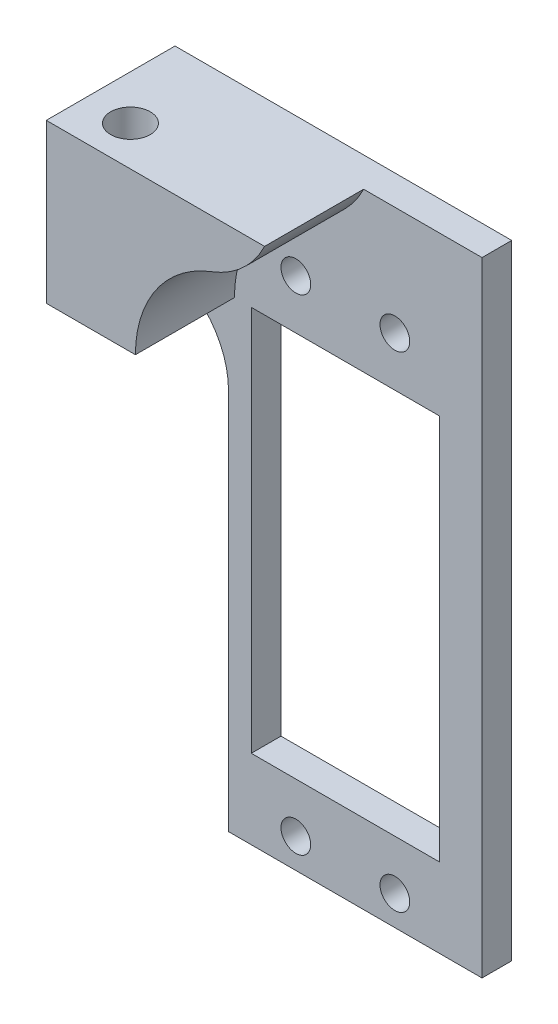
ISO-10303-21;
HEADER;
FILE_DESCRIPTION(('STEP AP214'),'2;1');
FILE_NAME('part.step','',(''),(''),'','','');
FILE_SCHEMA(('AUTOMOTIVE_DESIGN { 1 0 10303 214 1 1 1 1 }'));
ENDSEC;
DATA;
#1=APPLICATION_CONTEXT('core data for automotive mechanical design processes');
#2=APPLICATION_PROTOCOL_DEFINITION('international standard','automotive_design',2000,#1);
#3=PRODUCT_CONTEXT('',#1,'mechanical');
#4=PRODUCT('Part','Part','',(#3));
#5=PRODUCT_RELATED_PRODUCT_CATEGORY('part','',(#4));
#6=PRODUCT_DEFINITION_FORMATION('','',#4);
#7=PRODUCT_DEFINITION_CONTEXT('part definition',#1,'design');
#8=PRODUCT_DEFINITION('design','',#6,#7);
#9=PRODUCT_DEFINITION_SHAPE('','',#8);
#10=(LENGTH_UNIT() NAMED_UNIT(*) SI_UNIT(.MILLI.,.METRE.));
#11=(NAMED_UNIT(*) PLANE_ANGLE_UNIT() SI_UNIT($,.RADIAN.));
#12=(NAMED_UNIT(*) SI_UNIT($,.STERADIAN.) SOLID_ANGLE_UNIT());
#13=UNCERTAINTY_MEASURE_WITH_UNIT(LENGTH_MEASURE(1.E-05),#10,'distance_accuracy_value','');
#14=(GEOMETRIC_REPRESENTATION_CONTEXT(3) GLOBAL_UNCERTAINTY_ASSIGNED_CONTEXT((#13)) GLOBAL_UNIT_ASSIGNED_CONTEXT((#10,
#11,#12)) REPRESENTATION_CONTEXT('',''));
#15=CARTESIAN_POINT('',(0.,0.,0.));
#16=DIRECTION('',(0.,0.,1.));
#17=DIRECTION('',(1.,0.,0.));
#18=AXIS2_PLACEMENT_3D('',#15,#16,#17);
#19=CARTESIAN_POINT('',(-20.2,35.5,0.));
#20=DIRECTION('',(0.,1.,0.));
#21=DIRECTION('',(0.,0.,1.));
#22=AXIS2_PLACEMENT_3D('',#19,#20,#21);
#23=PLANE('',#22);
#24=DIRECTION('',(0.,0.,-1.));
#25=VECTOR('',#24,1.);
#26=CARTESIAN_POINT('',(13.8,35.5,3.));
#27=LINE('',#26,#25);
#28=CARTESIAN_POINT('',(13.8,35.5,3.));
#29=VERTEX_POINT('',#28);
#30=CARTESIAN_POINT('',(13.8,35.5,0.));
#31=VERTEX_POINT('',#30);
#32=EDGE_CURVE('E109',#29,#31,#27,.T.);
#33=ORIENTED_EDGE('',*,*,#32,.T.);
#34=DIRECTION('',(-1.,0.,0.));
#35=VECTOR('',#34,1.);
#36=CARTESIAN_POINT('',(-20.2,35.5,0.));
#37=LINE('',#36,#35);
#38=CARTESIAN_POINT('',(-20.2,35.5,0.));
#39=VERTEX_POINT('',#38);
#40=EDGE_CURVE('E102',#31,#39,#37,.T.);
#41=ORIENTED_EDGE('',*,*,#40,.T.);
#42=DIRECTION('',(0.,0.,-1.));
#43=VECTOR('',#42,1.);
#44=CARTESIAN_POINT('',(-20.2,35.5,3.));
#45=LINE('',#44,#43);
#46=CARTESIAN_POINT('',(-20.2,35.5,13.));
#47=VERTEX_POINT('',#46);
#48=EDGE_CURVE('E113',#47,#39,#45,.T.);
#49=ORIENTED_EDGE('',*,*,#48,.F.);
#50=DIRECTION('',(-1.,0.,0.));
#51=VECTOR('',#50,1.);
#52=CARTESIAN_POINT('',(-20.2,35.5,13.));
#53=LINE('',#52,#51);
#54=CARTESIAN_POINT('',(1.8435690653188,35.5,13.));
#55=VERTEX_POINT('',#54);
#56=EDGE_CURVE('E94',#55,#47,#53,.T.);
#57=ORIENTED_EDGE('',*,*,#56,.F.);
#58=DIRECTION('',(0.,0.,-1.));
#59=VECTOR('',#58,1.);
#60=CARTESIAN_POINT('',(1.8435690653188,35.5,3.));
#61=LINE('',#60,#59);
#62=CARTESIAN_POINT('',(1.8435690653188,35.5,3.));
#63=VERTEX_POINT('',#62);
#64=EDGE_CURVE('E93',#55,#63,#61,.T.);
#65=ORIENTED_EDGE('',*,*,#64,.T.);
#66=DIRECTION('',(-1.,0.,0.));
#67=VECTOR('',#66,1.);
#68=CARTESIAN_POINT('',(-20.2,35.5,3.));
#69=LINE('',#68,#67);
#70=EDGE_CURVE('E112',#29,#63,#69,.T.);
#71=ORIENTED_EDGE('',*,*,#70,.F.);
#72=EDGE_LOOP('',(#33,#41,#49,#57,#65,#71));
#73=FACE_BOUND('',#72,.T.);
#74=CARTESIAN_POINT('',(-15.7,35.5,9.));
#75=DIRECTION('',(0.,-1.,0.));
#76=DIRECTION('',(0.,0.,-1.));
#77=AXIS2_PLACEMENT_3D('',#74,#75,#76);
#78=CIRCLE('',#77,2.);
#79=CARTESIAN_POINT('',(-15.7,35.5,7.));
#80=VERTEX_POINT('',#79);
#81=EDGE_CURVE('E44',#80,#80,#78,.T.);
#82=ORIENTED_EDGE('',*,*,#81,.T.);
#83=EDGE_LOOP('',(#82));
#84=FACE_BOUND('',#83,.T.);
#85=ADVANCED_FACE('F34',(#73,#84),#23,.T.);
#86=CARTESIAN_POINT('',(-20.2,11.1,3.));
#87=DIRECTION('',(0.,0.,1.));
#88=DIRECTION('',(1.,0.,0.));
#89=AXIS2_PLACEMENT_3D('',#86,#87,#88);
#90=PLANE('',#89);
#91=CARTESIAN_POINT('',(5.,-24.5,3.));
#92=DIRECTION('',(0.,0.,1.));
#93=DIRECTION('',(1.,0.,0.));
#94=AXIS2_PLACEMENT_3D('',#91,#92,#93);
#95=CIRCLE('',#94,1.5);
#96=CARTESIAN_POINT('',(6.5,-24.5,3.));
#97=VERTEX_POINT('',#96);
#98=EDGE_CURVE('E127',#97,#97,#95,.T.);
#99=ORIENTED_EDGE('',*,*,#98,.F.);
#100=EDGE_LOOP('',(#99));
#101=FACE_BOUND('',#100,.T.);
#102=CARTESIAN_POINT('',(5.,24.5,3.));
#103=DIRECTION('',(0.,0.,1.));
#104=DIRECTION('',(1.,0.,0.));
#105=AXIS2_PLACEMENT_3D('',#102,#103,#104);
#106=CIRCLE('',#105,1.5);
#107=CARTESIAN_POINT('',(6.5,24.5,3.));
#108=VERTEX_POINT('',#107);
#109=EDGE_CURVE('E139',#108,#108,#106,.T.);
#110=ORIENTED_EDGE('',*,*,#109,.F.);
#111=EDGE_LOOP('',(#110));
#112=FACE_BOUND('',#111,.T.);
#113=DIRECTION('',(-1.,0.,0.));
#114=VECTOR('',#113,1.);
#115=CARTESIAN_POINT('',(-9.5,19.5,3.));
#116=LINE('',#115,#114);
#117=CARTESIAN_POINT('',(9.5,19.5,3.));
#118=VERTEX_POINT('',#117);
#119=CARTESIAN_POINT('',(-9.5,19.5,3.));
#120=VERTEX_POINT('',#119);
#121=EDGE_CURVE('E155',#118,#120,#116,.T.);
#122=ORIENTED_EDGE('',*,*,#121,.F.);
#123=DIRECTION('',(0.,1.,0.));
#124=VECTOR('',#123,1.);
#125=CARTESIAN_POINT('',(9.5,19.5,3.));
#126=LINE('',#125,#124);
#127=CARTESIAN_POINT('',(9.5,-19.5,3.));
#128=VERTEX_POINT('',#127);
#129=EDGE_CURVE('E151',#128,#118,#126,.T.);
#130=ORIENTED_EDGE('',*,*,#129,.F.);
#131=DIRECTION('',(1.,0.,0.));
#132=VECTOR('',#131,1.);
#133=CARTESIAN_POINT('',(-9.5,-19.5,3.));
#134=LINE('',#133,#132);
#135=CARTESIAN_POINT('',(-9.5,-19.5,3.));
#136=VERTEX_POINT('',#135);
#137=EDGE_CURVE('E161',#136,#128,#134,.T.);
#138=ORIENTED_EDGE('',*,*,#137,.F.);
#139=DIRECTION('',(0.,-1.,0.));
#140=VECTOR('',#139,1.);
#141=CARTESIAN_POINT('',(-9.5,19.5,3.));
#142=LINE('',#141,#140);
#143=EDGE_CURVE('E158',#120,#136,#142,.T.);
#144=ORIENTED_EDGE('',*,*,#143,.F.);
#145=EDGE_LOOP('',(#122,#130,#138,#144));
#146=FACE_BOUND('',#145,.T.);
#147=CARTESIAN_POINT('',(-5.,24.5,3.));
#148=DIRECTION('',(0.,0.,1.));
#149=DIRECTION('',(1.,0.,0.));
#150=AXIS2_PLACEMENT_3D('',#147,#148,#149);
#151=CIRCLE('',#150,1.5);
#152=CARTESIAN_POINT('',(-3.5,24.5,3.));
#153=VERTEX_POINT('',#152);
#154=EDGE_CURVE('E145',#153,#153,#151,.T.);
#155=ORIENTED_EDGE('',*,*,#154,.F.);
#156=EDGE_LOOP('',(#155));
#157=FACE_BOUND('',#156,.T.);
#158=CARTESIAN_POINT('',(-4.99999999999999,-24.5,3.));
#159=DIRECTION('',(0.,0.,1.));
#160=DIRECTION('',(1.,0.,0.));
#161=AXIS2_PLACEMENT_3D('',#158,#159,#160);
#162=CIRCLE('',#161,1.5);
#163=CARTESIAN_POINT('',(-3.49999999999999,-24.5,3.));
#164=VERTEX_POINT('',#163);
#165=EDGE_CURVE('E133',#164,#164,#162,.T.);
#166=ORIENTED_EDGE('',*,*,#165,.F.);
#167=EDGE_LOOP('',(#166));
#168=FACE_BOUND('',#167,.T.);
#169=DIRECTION('',(0.,1.,0.));
#170=VECTOR('',#169,1.);
#171=CARTESIAN_POINT('',(13.8,38.5,3.));
#172=LINE('',#171,#170);
#173=CARTESIAN_POINT('',(13.8,-27.5,3.));
#174=VERTEX_POINT('',#173);
#175=EDGE_CURVE('E103',#174,#29,#172,.T.);
#176=ORIENTED_EDGE('',*,*,#175,.T.);
#177=ORIENTED_EDGE('',*,*,#70,.T.);
#178=CARTESIAN_POINT('',(-6.90000000000001,39.7,3.));
#179=DIRECTION('',(0.,0.,1.));
#180=DIRECTION('',(1.,0.,0.));
#181=AXIS2_PLACEMENT_3D('',#178,#179,#180);
#182=CIRCLE('',#181,9.7);
#183=CARTESIAN_POINT('',(-3.49494735447985,30.6172902456791,3.));
#184=VERTEX_POINT('',#183);
#185=EDGE_CURVE('E38',#184,#63,#182,.T.);
#186=ORIENTED_EDGE('',*,*,#185,.F.);
#187=CARTESIAN_POINT('',(0.672857142857135,19.5,3.));
#188=DIRECTION('',(0.,0.,-1.));
#189=DIRECTION('',(1.,0.,0.));
#190=AXIS2_PLACEMENT_3D('',#187,#188,#189);
#191=CIRCLE('',#190,11.8728571428571);
#192=CARTESIAN_POINT('',(-11.2,19.5,3.));
#193=VERTEX_POINT('',#192);
#194=EDGE_CURVE('E85',#193,#184,#191,.T.);
#195=ORIENTED_EDGE('',*,*,#194,.F.);
#196=DIRECTION('',(1.,0.,0.));
#197=VECTOR('',#196,1.);
#198=CARTESIAN_POINT('',(-20.2,19.5,3.));
#199=LINE('',#198,#197);
#200=CARTESIAN_POINT('',(-20.2,19.5,3.));
#201=VERTEX_POINT('',#200);
#202=EDGE_CURVE('E117',#201,#193,#199,.T.);
#203=ORIENTED_EDGE('',*,*,#202,.F.);
#204=CARTESIAN_POINT('',(-20.2,11.1,3.));
#205=DIRECTION('',(0.,0.,-1.));
#206=DIRECTION('',(1.,0.,0.));
#207=AXIS2_PLACEMENT_3D('',#204,#205,#206);
#208=CIRCLE('',#207,8.4);
#209=CARTESIAN_POINT('',(-11.8,11.1,3.));
#210=VERTEX_POINT('',#209);
#211=EDGE_CURVE('E107',#201,#210,#208,.T.);
#212=ORIENTED_EDGE('',*,*,#211,.T.);
#213=DIRECTION('',(0.,-1.,0.));
#214=VECTOR('',#213,1.);
#215=CARTESIAN_POINT('',(-11.8,11.1,3.));
#216=LINE('',#215,#214);
#217=CARTESIAN_POINT('',(-11.8,-27.5,3.));
#218=VERTEX_POINT('',#217);
#219=EDGE_CURVE('E187',#210,#218,#216,.T.);
#220=ORIENTED_EDGE('',*,*,#219,.T.);
#221=DIRECTION('',(1.,0.,0.));
#222=VECTOR('',#221,1.);
#223=CARTESIAN_POINT('',(-11.8,-27.5,3.));
#224=LINE('',#223,#222);
#225=EDGE_CURVE('E190',#218,#174,#224,.T.);
#226=ORIENTED_EDGE('',*,*,#225,.T.);
#227=EDGE_LOOP('',(#176,#177,#186,#195,#203,#212,#220,#226));
#228=FACE_BOUND('',#227,.T.);
#229=ADVANCED_FACE('F256',(#101,#112,#146,#157,#168,#228),#90,.T.);
#230=CARTESIAN_POINT('',(-11.8,11.1,3.));
#231=DIRECTION('',(1.,0.,0.));
#232=DIRECTION('',(0.,1.,0.));
#233=AXIS2_PLACEMENT_3D('',#230,#231,#232);
#234=PLANE('',#233);
#235=DIRECTION('',(0.,-1.,0.));
#236=VECTOR('',#235,1.);
#237=CARTESIAN_POINT('',(-11.8,11.1,0.));
#238=LINE('',#237,#236);
#239=CARTESIAN_POINT('',(-11.8,11.1,0.));
#240=VERTEX_POINT('',#239);
#241=CARTESIAN_POINT('',(-11.8,-27.5,0.));
#242=VERTEX_POINT('',#241);
#243=EDGE_CURVE('E202',#240,#242,#238,.T.);
#244=ORIENTED_EDGE('',*,*,#243,.T.);
#245=DIRECTION('',(0.,0.,-1.));
#246=VECTOR('',#245,1.);
#247=CARTESIAN_POINT('',(-11.8,-27.5,3.));
#248=LINE('',#247,#246);
#249=EDGE_CURVE('E209',#218,#242,#248,.T.);
#250=ORIENTED_EDGE('',*,*,#249,.F.);
#251=ORIENTED_EDGE('',*,*,#219,.F.);
#252=DIRECTION('',(0.,0.,-1.));
#253=VECTOR('',#252,1.);
#254=CARTESIAN_POINT('',(-11.8,11.1,3.));
#255=LINE('',#254,#253);
#256=EDGE_CURVE('E212',#210,#240,#255,.T.);
#257=ORIENTED_EDGE('',*,*,#256,.T.);
#258=EDGE_LOOP('',(#244,#250,#251,#257));
#259=FACE_BOUND('',#258,.T.);
#260=ADVANCED_FACE('F250',(#259),#234,.F.);
#261=CARTESIAN_POINT('',(-11.8,-27.5,3.));
#262=DIRECTION('',(0.,1.,0.));
#263=DIRECTION('',(0.,0.,1.));
#264=AXIS2_PLACEMENT_3D('',#261,#262,#263);
#265=PLANE('',#264);
#266=DIRECTION('',(1.,0.,0.));
#267=VECTOR('',#266,1.);
#268=CARTESIAN_POINT('',(-11.8,-27.5,0.));
#269=LINE('',#268,#267);
#270=CARTESIAN_POINT('',(13.8,-27.5,0.));
#271=VERTEX_POINT('',#270);
#272=EDGE_CURVE('E106',#242,#271,#269,.T.);
#273=ORIENTED_EDGE('',*,*,#272,.T.);
#274=DIRECTION('',(0.,0.,-1.));
#275=VECTOR('',#274,1.);
#276=CARTESIAN_POINT('',(13.8,-27.5,3.));
#277=LINE('',#276,#275);
#278=EDGE_CURVE('E193',#174,#271,#277,.T.);
#279=ORIENTED_EDGE('',*,*,#278,.F.);
#280=ORIENTED_EDGE('',*,*,#225,.F.);
#281=ORIENTED_EDGE('',*,*,#249,.T.);
#282=EDGE_LOOP('',(#273,#279,#280,#281));
#283=FACE_BOUND('',#282,.T.);
#284=ADVANCED_FACE('F302',(#283),#265,.F.);
#285=CARTESIAN_POINT('',(13.8,38.5,3.));
#286=DIRECTION('',(-1.,0.,0.));
#287=DIRECTION('',(0.,-1.,0.));
#288=AXIS2_PLACEMENT_3D('',#285,#286,#287);
#289=PLANE('',#288);
#290=ORIENTED_EDGE('',*,*,#32,.F.);
#291=ORIENTED_EDGE('',*,*,#175,.F.);
#292=ORIENTED_EDGE('',*,*,#278,.T.);
#293=DIRECTION('',(0.,1.,0.));
#294=VECTOR('',#293,1.);
#295=CARTESIAN_POINT('',(13.8,38.5,0.));
#296=LINE('',#295,#294);
#297=EDGE_CURVE('E98',#271,#31,#296,.T.);
#298=ORIENTED_EDGE('',*,*,#297,.T.);
#299=EDGE_LOOP('',(#290,#291,#292,#298));
#300=FACE_BOUND('',#299,.T.);
#301=ADVANCED_FACE('F306',(#300),#289,.F.);
#302=CARTESIAN_POINT('',(-9.5,-19.5,3.));
#303=DIRECTION('',(0.,1.,0.));
#304=DIRECTION('',(0.,0.,1.));
#305=AXIS2_PLACEMENT_3D('',#302,#303,#304);
#306=PLANE('',#305);
#307=DIRECTION('',(1.,0.,0.));
#308=VECTOR('',#307,1.);
#309=CARTESIAN_POINT('',(-9.5,-19.5,0.));
#310=LINE('',#309,#308);
#311=CARTESIAN_POINT('',(-9.5,-19.5,0.));
#312=VERTEX_POINT('',#311);
#313=CARTESIAN_POINT('',(9.5,-19.5,0.));
#314=VERTEX_POINT('',#313);
#315=EDGE_CURVE('E154',#312,#314,#310,.T.);
#316=ORIENTED_EDGE('',*,*,#315,.F.);
#317=DIRECTION('',(0.,0.,-1.));
#318=VECTOR('',#317,1.);
#319=CARTESIAN_POINT('',(-9.5,-19.5,3.));
#320=LINE('',#319,#318);
#321=EDGE_CURVE('E177',#136,#312,#320,.T.);
#322=ORIENTED_EDGE('',*,*,#321,.F.);
#323=ORIENTED_EDGE('',*,*,#137,.T.);
#324=DIRECTION('',(0.,0.,-1.));
#325=VECTOR('',#324,1.);
#326=CARTESIAN_POINT('',(9.5,-19.5,3.));
#327=LINE('',#326,#325);
#328=EDGE_CURVE('E164',#128,#314,#327,.T.);
#329=ORIENTED_EDGE('',*,*,#328,.T.);
#330=EDGE_LOOP('',(#316,#322,#323,#329));
#331=FACE_BOUND('',#330,.T.);
#332=ADVANCED_FACE('F344',(#331),#306,.T.);
#333=CARTESIAN_POINT('',(-9.5,19.5,3.));
#334=DIRECTION('',(1.,0.,0.));
#335=DIRECTION('',(0.,1.,0.));
#336=AXIS2_PLACEMENT_3D('',#333,#334,#335);
#337=PLANE('',#336);
#338=DIRECTION('',(0.,-1.,0.));
#339=VECTOR('',#338,1.);
#340=CARTESIAN_POINT('',(-9.5,19.5,0.));
#341=LINE('',#340,#339);
#342=CARTESIAN_POINT('',(-9.5,19.5,0.));
#343=VERTEX_POINT('',#342);
#344=EDGE_CURVE('E170',#343,#312,#341,.T.);
#345=ORIENTED_EDGE('',*,*,#344,.F.);
#346=DIRECTION('',(0.,0.,-1.));
#347=VECTOR('',#346,1.);
#348=CARTESIAN_POINT('',(-9.5,19.5,3.));
#349=LINE('',#348,#347);
#350=EDGE_CURVE('E180',#120,#343,#349,.T.);
#351=ORIENTED_EDGE('',*,*,#350,.F.);
#352=ORIENTED_EDGE('',*,*,#143,.T.);
#353=ORIENTED_EDGE('',*,*,#321,.T.);
#354=EDGE_LOOP('',(#345,#351,#352,#353));
#355=FACE_BOUND('',#354,.T.);
#356=ADVANCED_FACE('F290',(#355),#337,.T.);
#357=CARTESIAN_POINT('',(-9.5,19.5,3.));
#358=DIRECTION('',(0.,-1.,0.));
#359=DIRECTION('',(0.,0.,-1.));
#360=AXIS2_PLACEMENT_3D('',#357,#358,#359);
#361=PLANE('',#360);
#362=DIRECTION('',(-1.,0.,0.));
#363=VECTOR('',#362,1.);
#364=CARTESIAN_POINT('',(-9.5,19.5,0.));
#365=LINE('',#364,#363);
#366=CARTESIAN_POINT('',(9.5,19.5,0.));
#367=VERTEX_POINT('',#366);
#368=EDGE_CURVE('E167',#367,#343,#365,.T.);
#369=ORIENTED_EDGE('',*,*,#368,.F.);
#370=DIRECTION('',(0.,0.,-1.));
#371=VECTOR('',#370,1.);
#372=CARTESIAN_POINT('',(9.5,19.5,3.));
#373=LINE('',#372,#371);
#374=EDGE_CURVE('E101',#118,#367,#373,.T.);
#375=ORIENTED_EDGE('',*,*,#374,.F.);
#376=ORIENTED_EDGE('',*,*,#121,.T.);
#377=ORIENTED_EDGE('',*,*,#350,.T.);
#378=EDGE_LOOP('',(#369,#375,#376,#377));
#379=FACE_BOUND('',#378,.T.);
#380=ADVANCED_FACE('F284',(#379),#361,.T.);
#381=CARTESIAN_POINT('',(9.5,19.5,3.));
#382=DIRECTION('',(-1.,0.,0.));
#383=DIRECTION('',(0.,-1.,0.));
#384=AXIS2_PLACEMENT_3D('',#381,#382,#383);
#385=PLANE('',#384);
#386=DIRECTION('',(0.,1.,0.));
#387=VECTOR('',#386,1.);
#388=CARTESIAN_POINT('',(9.5,19.5,0.));
#389=LINE('',#388,#387);
#390=EDGE_CURVE('E148',#314,#367,#389,.T.);
#391=ORIENTED_EDGE('',*,*,#390,.F.);
#392=ORIENTED_EDGE('',*,*,#328,.F.);
#393=ORIENTED_EDGE('',*,*,#129,.T.);
#394=ORIENTED_EDGE('',*,*,#374,.T.);
#395=EDGE_LOOP('',(#391,#392,#393,#394));
#396=FACE_BOUND('',#395,.T.);
#397=ADVANCED_FACE('F281',(#396),#385,.T.);
#398=CARTESIAN_POINT('',(-5.,24.5,3.));
#399=DIRECTION('',(0.,0.,-1.));
#400=DIRECTION('',(-1.,0.,0.));
#401=AXIS2_PLACEMENT_3D('',#398,#399,#400);
#402=CYLINDRICAL_SURFACE('',#401,1.5);
#403=ORIENTED_EDGE('',*,*,#154,.T.);
#404=EDGE_LOOP('',(#403));
#405=FACE_BOUND('',#404,.T.);
#406=CARTESIAN_POINT('',(-5.,24.5,0.));
#407=DIRECTION('',(0.,0.,1.));
#408=DIRECTION('',(1.,0.,0.));
#409=AXIS2_PLACEMENT_3D('',#406,#407,#408);
#410=CIRCLE('',#409,1.5);
#411=CARTESIAN_POINT('',(-3.5,24.5,0.));
#412=VERTEX_POINT('',#411);
#413=EDGE_CURVE('E142',#412,#412,#410,.T.);
#414=ORIENTED_EDGE('',*,*,#413,.F.);
#415=EDGE_LOOP('',(#414));
#416=FACE_BOUND('',#415,.T.);
#417=ADVANCED_FACE('F417',(#405,#416),#402,.F.);
#418=CARTESIAN_POINT('',(5.,24.5,3.));
#419=DIRECTION('',(0.,0.,-1.));
#420=DIRECTION('',(-1.,0.,0.));
#421=AXIS2_PLACEMENT_3D('',#418,#419,#420);
#422=CYLINDRICAL_SURFACE('',#421,1.5);
#423=ORIENTED_EDGE('',*,*,#109,.T.);
#424=EDGE_LOOP('',(#423));
#425=FACE_BOUND('',#424,.T.);
#426=CARTESIAN_POINT('',(5.,24.5,0.));
#427=DIRECTION('',(0.,0.,1.));
#428=DIRECTION('',(1.,0.,0.));
#429=AXIS2_PLACEMENT_3D('',#426,#427,#428);
#430=CIRCLE('',#429,1.5);
#431=CARTESIAN_POINT('',(6.5,24.5,0.));
#432=VERTEX_POINT('',#431);
#433=EDGE_CURVE('E136',#432,#432,#430,.T.);
#434=ORIENTED_EDGE('',*,*,#433,.F.);
#435=EDGE_LOOP('',(#434));
#436=FACE_BOUND('',#435,.T.);
#437=ADVANCED_FACE('F407',(#425,#436),#422,.F.);
#438=CARTESIAN_POINT('',(-4.99999999999999,-24.5,3.));
#439=DIRECTION('',(0.,0.,-1.));
#440=DIRECTION('',(-1.,0.,0.));
#441=AXIS2_PLACEMENT_3D('',#438,#439,#440);
#442=CYLINDRICAL_SURFACE('',#441,1.5);
#443=ORIENTED_EDGE('',*,*,#165,.T.);
#444=EDGE_LOOP('',(#443));
#445=FACE_BOUND('',#444,.T.);
#446=CARTESIAN_POINT('',(-4.99999999999999,-24.5,0.));
#447=DIRECTION('',(0.,0.,1.));
#448=DIRECTION('',(1.,0.,0.));
#449=AXIS2_PLACEMENT_3D('',#446,#447,#448);
#450=CIRCLE('',#449,1.5);
#451=CARTESIAN_POINT('',(-3.49999999999999,-24.5,0.));
#452=VERTEX_POINT('',#451);
#453=EDGE_CURVE('E130',#452,#452,#450,.T.);
#454=ORIENTED_EDGE('',*,*,#453,.F.);
#455=EDGE_LOOP('',(#454));
#456=FACE_BOUND('',#455,.T.);
#457=ADVANCED_FACE('F398',(#445,#456),#442,.F.);
#458=CARTESIAN_POINT('',(5.,-24.5,3.));
#459=DIRECTION('',(0.,0.,-1.));
#460=DIRECTION('',(-1.,0.,0.));
#461=AXIS2_PLACEMENT_3D('',#458,#459,#460);
#462=CYLINDRICAL_SURFACE('',#461,1.5);
#463=ORIENTED_EDGE('',*,*,#98,.T.);
#464=EDGE_LOOP('',(#463));
#465=FACE_BOUND('',#464,.T.);
#466=CARTESIAN_POINT('',(5.,-24.5,0.));
#467=DIRECTION('',(0.,0.,1.));
#468=DIRECTION('',(1.,0.,0.));
#469=AXIS2_PLACEMENT_3D('',#466,#467,#468);
#470=CIRCLE('',#469,1.5);
#471=CARTESIAN_POINT('',(6.5,-24.5,0.));
#472=VERTEX_POINT('',#471);
#473=EDGE_CURVE('E126',#472,#472,#470,.T.);
#474=ORIENTED_EDGE('',*,*,#473,.F.);
#475=EDGE_LOOP('',(#474));
#476=FACE_BOUND('',#475,.T.);
#477=ADVANCED_FACE('F389',(#465,#476),#462,.F.);
#478=CARTESIAN_POINT('',(-20.2,11.1,3.));
#479=DIRECTION('',(0.,0.,-1.));
#480=DIRECTION('',(-1.,0.,0.));
#481=AXIS2_PLACEMENT_3D('',#478,#479,#480);
#482=CYLINDRICAL_SURFACE('',#481,8.4);
#483=CARTESIAN_POINT('',(-20.2,11.1,0.));
#484=DIRECTION('',(0.,0.,-1.));
#485=DIRECTION('',(1.,0.,0.));
#486=AXIS2_PLACEMENT_3D('',#483,#484,#485);
#487=CIRCLE('',#486,8.4);
#488=CARTESIAN_POINT('',(-20.2,19.5,0.));
#489=VERTEX_POINT('',#488);
#490=EDGE_CURVE('E199',#489,#240,#487,.T.);
#491=ORIENTED_EDGE('',*,*,#490,.T.);
#492=ORIENTED_EDGE('',*,*,#256,.F.);
#493=ORIENTED_EDGE('',*,*,#211,.F.);
#494=DIRECTION('',(0.,0.,-1.));
#495=VECTOR('',#494,1.);
#496=CARTESIAN_POINT('',(-20.2,19.5,3.));
#497=LINE('',#496,#495);
#498=EDGE_CURVE('E215',#201,#489,#497,.T.);
#499=ORIENTED_EDGE('',*,*,#498,.T.);
#500=EDGE_LOOP('',(#491,#492,#493,#499));
#501=FACE_BOUND('',#500,.T.);
#502=ADVANCED_FACE('F243',(#501),#482,.F.);
#503=CARTESIAN_POINT('',(-20.2,11.1,0.));
#504=DIRECTION('',(0.,0.,1.));
#505=DIRECTION('',(1.,0.,0.));
#506=AXIS2_PLACEMENT_3D('',#503,#504,#505);
#507=PLANE('',#506);
#508=ORIENTED_EDGE('',*,*,#473,.T.);
#509=EDGE_LOOP('',(#508));
#510=FACE_BOUND('',#509,.T.);
#511=ORIENTED_EDGE('',*,*,#453,.T.);
#512=EDGE_LOOP('',(#511));
#513=FACE_BOUND('',#512,.T.);
#514=ORIENTED_EDGE('',*,*,#433,.T.);
#515=EDGE_LOOP('',(#514));
#516=FACE_BOUND('',#515,.T.);
#517=ORIENTED_EDGE('',*,*,#413,.T.);
#518=EDGE_LOOP('',(#517));
#519=FACE_BOUND('',#518,.T.);
#520=ORIENTED_EDGE('',*,*,#390,.T.);
#521=ORIENTED_EDGE('',*,*,#368,.T.);
#522=ORIENTED_EDGE('',*,*,#344,.T.);
#523=ORIENTED_EDGE('',*,*,#315,.T.);
#524=EDGE_LOOP('',(#520,#521,#522,#523));
#525=FACE_BOUND('',#524,.T.);
#526=ORIENTED_EDGE('',*,*,#40,.F.);
#527=ORIENTED_EDGE('',*,*,#297,.F.);
#528=ORIENTED_EDGE('',*,*,#272,.F.);
#529=ORIENTED_EDGE('',*,*,#243,.F.);
#530=ORIENTED_EDGE('',*,*,#490,.F.);
#531=DIRECTION('',(0.,-1.,0.));
#532=VECTOR('',#531,1.);
#533=CARTESIAN_POINT('',(-20.2,19.5,0.));
#534=LINE('',#533,#532);
#535=EDGE_CURVE('E196',#39,#489,#534,.T.);
#536=ORIENTED_EDGE('',*,*,#535,.F.);
#537=EDGE_LOOP('',(#526,#527,#528,#529,#530,#536));
#538=FACE_BOUND('',#537,.T.);
#539=ADVANCED_FACE('F234',(#510,#513,#516,#519,#525,#538),#507,.F.);
#540=CARTESIAN_POINT('',(0.672857142857135,19.5,13.));
#541=DIRECTION('',(0.,0.,-1.));
#542=DIRECTION('',(-1.,0.,0.));
#543=AXIS2_PLACEMENT_3D('',#540,#541,#542);
#544=CYLINDRICAL_SURFACE('',#543,11.8728571428571);
#545=ORIENTED_EDGE('',*,*,#194,.T.);
#546=DIRECTION('',(0.,0.,-1.));
#547=VECTOR('',#546,1.);
#548=CARTESIAN_POINT('',(-3.49494735447985,30.6172902456791,13.));
#549=LINE('',#548,#547);
#550=CARTESIAN_POINT('',(-3.49494735447985,30.6172902456791,13.));
#551=VERTEX_POINT('',#550);
#552=EDGE_CURVE('E83',#551,#184,#549,.T.);
#553=ORIENTED_EDGE('',*,*,#552,.F.);
#554=CARTESIAN_POINT('',(0.672857142857135,19.5,13.));
#555=DIRECTION('',(0.,0.,-1.));
#556=DIRECTION('',(1.,0.,0.));
#557=AXIS2_PLACEMENT_3D('',#554,#555,#556);
#558=CIRCLE('',#557,11.8728571428571);
#559=CARTESIAN_POINT('',(-11.2,19.5,13.));
#560=VERTEX_POINT('',#559);
#561=EDGE_CURVE('E69',#560,#551,#558,.T.);
#562=ORIENTED_EDGE('',*,*,#561,.F.);
#563=DIRECTION('',(0.,0.,-1.));
#564=VECTOR('',#563,1.);
#565=CARTESIAN_POINT('',(-11.2,19.5,13.));
#566=LINE('',#565,#564);
#567=EDGE_CURVE('E88',#560,#193,#566,.T.);
#568=ORIENTED_EDGE('',*,*,#567,.T.);
#569=EDGE_LOOP('',(#545,#553,#562,#568));
#570=FACE_BOUND('',#569,.T.);
#571=ADVANCED_FACE('F84',(#570),#544,.F.);
#572=CARTESIAN_POINT('',(-20.2,19.5,13.));
#573=DIRECTION('',(0.,1.,0.));
#574=DIRECTION('',(0.,0.,1.));
#575=AXIS2_PLACEMENT_3D('',#572,#573,#574);
#576=PLANE('',#575);
#577=CARTESIAN_POINT('',(-15.7,19.5,9.));
#578=DIRECTION('',(0.,-1.,0.));
#579=DIRECTION('',(0.,0.,-1.));
#580=AXIS2_PLACEMENT_3D('',#577,#578,#579);
#581=CIRCLE('',#580,2.);
#582=CARTESIAN_POINT('',(-15.7,19.5,7.));
#583=VERTEX_POINT('',#582);
#584=EDGE_CURVE('E11',#583,#583,#581,.T.);
#585=ORIENTED_EDGE('',*,*,#584,.F.);
#586=EDGE_LOOP('',(#585));
#587=FACE_BOUND('',#586,.T.);
#588=ORIENTED_EDGE('',*,*,#202,.T.);
#589=ORIENTED_EDGE('',*,*,#567,.F.);
#590=DIRECTION('',(1.,0.,0.));
#591=VECTOR('',#590,1.);
#592=CARTESIAN_POINT('',(-20.2,19.5,13.));
#593=LINE('',#592,#591);
#594=CARTESIAN_POINT('',(-20.2,19.5,13.));
#595=VERTEX_POINT('',#594);
#596=EDGE_CURVE('E77',#595,#560,#593,.T.);
#597=ORIENTED_EDGE('',*,*,#596,.F.);
#598=DIRECTION('',(0.,0.,-1.));
#599=VECTOR('',#598,1.);
#600=CARTESIAN_POINT('',(-20.2,19.5,13.));
#601=LINE('',#600,#599);
#602=EDGE_CURVE('E87',#595,#201,#601,.T.);
#603=ORIENTED_EDGE('',*,*,#602,.T.);
#604=EDGE_LOOP('',(#588,#589,#597,#603));
#605=FACE_BOUND('',#604,.T.);
#606=ADVANCED_FACE('F315',(#587,#605),#576,.F.);
#607=CARTESIAN_POINT('',(-15.7,55.0568542494924,9.));
#608=DIRECTION('',(0.,-1.,0.));
#609=DIRECTION('',(0.,0.,-1.));
#610=AXIS2_PLACEMENT_3D('',#607,#608,#609);
#611=CYLINDRICAL_SURFACE('',#610,2.);
#612=ORIENTED_EDGE('',*,*,#584,.T.);
#613=EDGE_LOOP('',(#612));
#614=FACE_BOUND('',#613,.T.);
#615=ORIENTED_EDGE('',*,*,#81,.F.);
#616=EDGE_LOOP('',(#615));
#617=FACE_BOUND('',#616,.T.);
#618=ADVANCED_FACE('F36',(#614,#617),#611,.F.);
#619=CARTESIAN_POINT('',(-20.2,19.5,3.));
#620=DIRECTION('',(1.,0.,0.));
#621=DIRECTION('',(0.,1.,0.));
#622=AXIS2_PLACEMENT_3D('',#619,#620,#621);
#623=PLANE('',#622);
#624=ORIENTED_EDGE('',*,*,#535,.T.);
#625=ORIENTED_EDGE('',*,*,#498,.F.);
#626=ORIENTED_EDGE('',*,*,#602,.F.);
#627=DIRECTION('',(0.,-1.,0.));
#628=VECTOR('',#627,1.);
#629=CARTESIAN_POINT('',(-20.2,19.5,13.));
#630=LINE('',#629,#628);
#631=EDGE_CURVE('E95',#47,#595,#630,.T.);
#632=ORIENTED_EDGE('',*,*,#631,.F.);
#633=ORIENTED_EDGE('',*,*,#48,.T.);
#634=EDGE_LOOP('',(#624,#625,#626,#632,#633));
#635=FACE_BOUND('',#634,.T.);
#636=ADVANCED_FACE('F223',(#635),#623,.F.);
#637=CARTESIAN_POINT('',(-6.9,39.7,3.));
#638=DIRECTION('',(0.,0.,-1.));
#639=DIRECTION('',(-1.,0.,0.));
#640=AXIS2_PLACEMENT_3D('',#637,#638,#639);
#641=CYLINDRICAL_SURFACE('',#640,9.7);
#642=ORIENTED_EDGE('',*,*,#64,.F.);
#643=CARTESIAN_POINT('',(-6.90000000000001,39.7,13.));
#644=DIRECTION('',(0.,0.,1.));
#645=DIRECTION('',(1.,0.,0.));
#646=AXIS2_PLACEMENT_3D('',#643,#644,#645);
#647=CIRCLE('',#646,9.7);
#648=EDGE_CURVE('E75',#551,#55,#647,.T.);
#649=ORIENTED_EDGE('',*,*,#648,.F.);
#650=ORIENTED_EDGE('',*,*,#552,.T.);
#651=ORIENTED_EDGE('',*,*,#185,.T.);
#652=EDGE_LOOP('',(#642,#649,#650,#651));
#653=FACE_BOUND('',#652,.T.);
#654=ADVANCED_FACE('F91',(#653),#641,.T.);
#655=CARTESIAN_POINT('',(0.672857142857135,19.5,13.));
#656=DIRECTION('',(0.,0.,1.));
#657=DIRECTION('',(1.,0.,0.));
#658=AXIS2_PLACEMENT_3D('',#655,#656,#657);
#659=PLANE('',#658);
#660=ORIENTED_EDGE('',*,*,#648,.T.);
#661=ORIENTED_EDGE('',*,*,#56,.T.);
#662=ORIENTED_EDGE('',*,*,#631,.T.);
#663=ORIENTED_EDGE('',*,*,#596,.T.);
#664=ORIENTED_EDGE('',*,*,#561,.T.);
#665=EDGE_LOOP('',(#660,#661,#662,#663,#664));
#666=FACE_BOUND('',#665,.T.);
#667=ADVANCED_FACE('F71',(#666),#659,.T.);
#668=CLOSED_SHELL('',(#85,#229,#260,#284,#301,#332,#356,#380,#397,#417,#437,#457,#477,#502,#539,
#571,#606,#618,#636,#654,#667));
#669=MANIFOLD_SOLID_BREP('B2',#668);
#670=ADVANCED_BREP_SHAPE_REPRESENTATION('',(#18,#669),#14);
#671=SHAPE_DEFINITION_REPRESENTATION(#9,#670);
ENDSEC;
END-ISO-10303-21;
